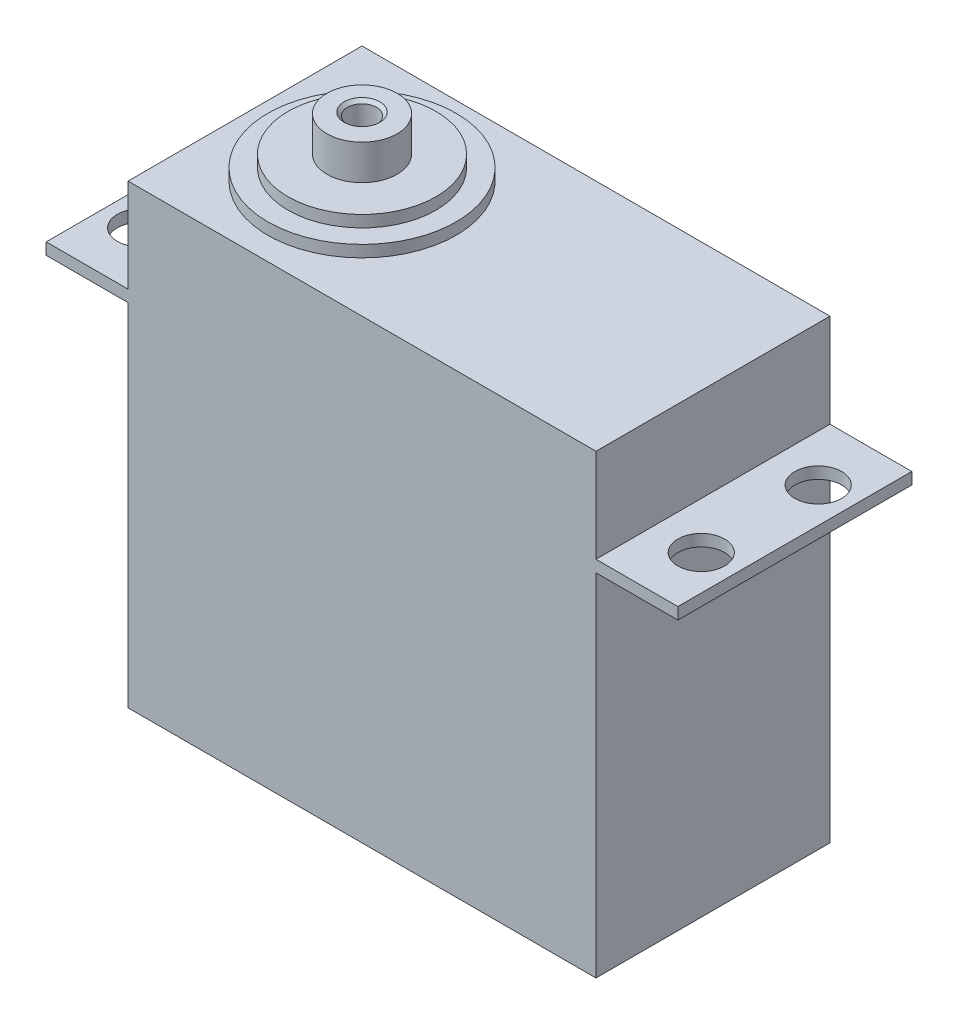
ISO-10303-21;
HEADER;
FILE_DESCRIPTION(('STEP AP214'),'2;1');
FILE_NAME('part.step','',(''),(''),'','','');
FILE_SCHEMA(('AUTOMOTIVE_DESIGN { 1 0 10303 214 1 1 1 1 }'));
ENDSEC;
DATA;
#1=APPLICATION_CONTEXT('core data for automotive mechanical design processes');
#2=APPLICATION_PROTOCOL_DEFINITION('international standard','automotive_design',2000,#1);
#3=PRODUCT_CONTEXT('',#1,'mechanical');
#4=PRODUCT('Part','Part','',(#3));
#5=PRODUCT_RELATED_PRODUCT_CATEGORY('part','',(#4));
#6=PRODUCT_DEFINITION_FORMATION('','',#4);
#7=PRODUCT_DEFINITION_CONTEXT('part definition',#1,'design');
#8=PRODUCT_DEFINITION('design','',#6,#7);
#9=PRODUCT_DEFINITION_SHAPE('','',#8);
#10=(LENGTH_UNIT() NAMED_UNIT(*) SI_UNIT(.MILLI.,.METRE.));
#11=(NAMED_UNIT(*) PLANE_ANGLE_UNIT() SI_UNIT($,.RADIAN.));
#12=(NAMED_UNIT(*) SI_UNIT($,.STERADIAN.) SOLID_ANGLE_UNIT());
#13=UNCERTAINTY_MEASURE_WITH_UNIT(LENGTH_MEASURE(1.E-05),#10,'distance_accuracy_value','');
#14=(GEOMETRIC_REPRESENTATION_CONTEXT(3) GLOBAL_UNCERTAINTY_ASSIGNED_CONTEXT((#13)) GLOBAL_UNIT_ASSIGNED_CONTEXT((#10,
#11,#12)) REPRESENTATION_CONTEXT('',''));
#15=CARTESIAN_POINT('',(0.,0.,0.));
#16=DIRECTION('',(0.,0.,1.));
#17=DIRECTION('',(1.,0.,0.));
#18=AXIS2_PLACEMENT_3D('',#15,#16,#17);
#19=CARTESIAN_POINT('',(-27.,11.5,0.));
#20=DIRECTION('',(0.,1.,0.));
#21=DIRECTION('',(0.,0.,1.));
#22=AXIS2_PLACEMENT_3D('',#19,#20,#21);
#23=PLANE('',#22);
#24=CARTESIAN_POINT('',(-24.,11.5,14.9262188694551));
#25=DIRECTION('',(0.,-1.,0.));
#26=DIRECTION('',(0.,0.,-1.));
#27=AXIS2_PLACEMENT_3D('',#24,#25,#26);
#28=CIRCLE('',#27,2.);
#29=CARTESIAN_POINT('',(-24.,11.5,12.9262188694551));
#30=VERTEX_POINT('',#29);
#31=EDGE_CURVE('E192',#30,#30,#28,.T.);
#32=ORIENTED_EDGE('',*,*,#31,.T.);
#33=EDGE_LOOP('',(#32));
#34=FACE_BOUND('',#33,.T.);
#35=DIRECTION('',(0.,0.,1.));
#36=VECTOR('',#35,1.);
#37=CARTESIAN_POINT('',(-20.,11.5,0.));
#38=LINE('',#37,#36);
#39=CARTESIAN_POINT('',(-20.,11.5,0.));
#40=VERTEX_POINT('',#39);
#41=CARTESIAN_POINT('',(-20.,11.5,20.));
#42=VERTEX_POINT('',#41);
#43=EDGE_CURVE('E230',#40,#42,#38,.T.);
#44=ORIENTED_EDGE('',*,*,#43,.F.);
#45=DIRECTION('',(1.,0.,0.));
#46=VECTOR('',#45,1.);
#47=CARTESIAN_POINT('',(-27.,11.5,0.));
#48=LINE('',#47,#46);
#49=CARTESIAN_POINT('',(-27.,11.5,0.));
#50=VERTEX_POINT('',#49);
#51=EDGE_CURVE('E257',#50,#40,#48,.T.);
#52=ORIENTED_EDGE('',*,*,#51,.F.);
#53=DIRECTION('',(0.,0.,1.));
#54=VECTOR('',#53,1.);
#55=CARTESIAN_POINT('',(-27.,11.5,0.));
#56=LINE('',#55,#54);
#57=CARTESIAN_POINT('',(-27.,11.5,20.));
#58=VERTEX_POINT('',#57);
#59=EDGE_CURVE('E235',#50,#58,#56,.T.);
#60=ORIENTED_EDGE('',*,*,#59,.T.);
#61=DIRECTION('',(1.,0.,0.));
#62=VECTOR('',#61,1.);
#63=CARTESIAN_POINT('',(-27.,11.5,20.));
#64=LINE('',#63,#62);
#65=EDGE_CURVE('E75',#58,#42,#64,.T.);
#66=ORIENTED_EDGE('',*,*,#65,.T.);
#67=EDGE_LOOP('',(#44,#52,#60,#66));
#68=FACE_BOUND('',#67,.T.);
#69=CARTESIAN_POINT('',(-24.,11.5,5.07378113054492));
#70=DIRECTION('',(0.,1.,0.));
#71=DIRECTION('',(0.,0.,1.));
#72=AXIS2_PLACEMENT_3D('',#69,#70,#71);
#73=CIRCLE('',#72,2.);
#74=CARTESIAN_POINT('',(-24.,11.5,7.07378113054492));
#75=VERTEX_POINT('',#74);
#76=EDGE_CURVE('E187',#75,#75,#73,.T.);
#77=ORIENTED_EDGE('',*,*,#76,.F.);
#78=EDGE_LOOP('',(#77));
#79=FACE_BOUND('',#78,.T.);
#80=ADVANCED_FACE('F49',(#34,#68,#79),#23,.T.);
#81=CARTESIAN_POINT('',(-27.,10.5,0.));
#82=DIRECTION('',(0.,1.,0.));
#83=DIRECTION('',(0.,0.,1.));
#84=AXIS2_PLACEMENT_3D('',#81,#82,#83);
#85=PLANE('',#84);
#86=DIRECTION('',(0.,0.,1.));
#87=VECTOR('',#86,1.);
#88=CARTESIAN_POINT('',(-20.,10.5,0.));
#89=LINE('',#88,#87);
#90=CARTESIAN_POINT('',(-20.,10.5,0.));
#91=VERTEX_POINT('',#90);
#92=CARTESIAN_POINT('',(-20.,10.5,20.));
#93=VERTEX_POINT('',#92);
#94=EDGE_CURVE('E236',#91,#93,#89,.T.);
#95=ORIENTED_EDGE('',*,*,#94,.T.);
#96=DIRECTION('',(1.,0.,0.));
#97=VECTOR('',#96,1.);
#98=CARTESIAN_POINT('',(-27.,10.5,20.));
#99=LINE('',#98,#97);
#100=CARTESIAN_POINT('',(-27.,10.5,20.));
#101=VERTEX_POINT('',#100);
#102=EDGE_CURVE('E246',#101,#93,#99,.T.);
#103=ORIENTED_EDGE('',*,*,#102,.F.);
#104=DIRECTION('',(0.,0.,1.));
#105=VECTOR('',#104,1.);
#106=CARTESIAN_POINT('',(-27.,10.5,0.));
#107=LINE('',#106,#105);
#108=CARTESIAN_POINT('',(-27.,10.5,0.));
#109=VERTEX_POINT('',#108);
#110=EDGE_CURVE('E243',#109,#101,#107,.T.);
#111=ORIENTED_EDGE('',*,*,#110,.F.);
#112=DIRECTION('',(1.,0.,0.));
#113=VECTOR('',#112,1.);
#114=CARTESIAN_POINT('',(-27.,10.5,0.));
#115=LINE('',#114,#113);
#116=EDGE_CURVE('E254',#109,#91,#115,.T.);
#117=ORIENTED_EDGE('',*,*,#116,.T.);
#118=EDGE_LOOP('',(#95,#103,#111,#117));
#119=FACE_BOUND('',#118,.T.);
#120=CARTESIAN_POINT('',(-24.,10.5,14.9262188694551));
#121=DIRECTION('',(0.,1.,0.));
#122=DIRECTION('',(0.,0.,1.));
#123=AXIS2_PLACEMENT_3D('',#120,#121,#122);
#124=CIRCLE('',#123,2.);
#125=CARTESIAN_POINT('',(-24.,10.5,16.9262188694551));
#126=VERTEX_POINT('',#125);
#127=EDGE_CURVE('E191',#126,#126,#124,.F.);
#128=ORIENTED_EDGE('',*,*,#127,.F.);
#129=EDGE_LOOP('',(#128));
#130=FACE_BOUND('',#129,.T.);
#131=CARTESIAN_POINT('',(-24.,10.5,5.07378113054492));
#132=DIRECTION('',(0.,1.,0.));
#133=DIRECTION('',(0.,0.,1.));
#134=AXIS2_PLACEMENT_3D('',#131,#132,#133);
#135=CIRCLE('',#134,2.);
#136=CARTESIAN_POINT('',(-24.,10.5,7.07378113054492));
#137=VERTEX_POINT('',#136);
#138=EDGE_CURVE('E216',#137,#137,#135,.T.);
#139=ORIENTED_EDGE('',*,*,#138,.T.);
#140=EDGE_LOOP('',(#139));
#141=FACE_BOUND('',#140,.T.);
#142=ADVANCED_FACE('F342',(#119,#130,#141),#85,.F.);
#143=CARTESIAN_POINT('',(20.,19.5,20.));
#144=DIRECTION('',(-1.,0.,0.));
#145=DIRECTION('',(0.,-1.,0.));
#146=AXIS2_PLACEMENT_3D('',#143,#144,#145);
#147=PLANE('',#146);
#148=DIRECTION('',(0.,0.,-1.));
#149=VECTOR('',#148,1.);
#150=CARTESIAN_POINT('',(20.,10.5,0.));
#151=LINE('',#150,#149);
#152=CARTESIAN_POINT('',(20.,10.5,20.));
#153=VERTEX_POINT('',#152);
#154=CARTESIAN_POINT('',(20.,10.5,0.));
#155=VERTEX_POINT('',#154);
#156=EDGE_CURVE('E202',#153,#155,#151,.T.);
#157=ORIENTED_EDGE('',*,*,#156,.F.);
#158=DIRECTION('',(0.,1.,0.));
#159=VECTOR('',#158,1.);
#160=CARTESIAN_POINT('',(20.,19.5,20.));
#161=LINE('',#160,#159);
#162=CARTESIAN_POINT('',(20.,-19.5,20.));
#163=VERTEX_POINT('',#162);
#164=EDGE_CURVE('E263',#163,#153,#161,.T.);
#165=ORIENTED_EDGE('',*,*,#164,.F.);
#166=DIRECTION('',(0.,0.,-1.));
#167=VECTOR('',#166,1.);
#168=CARTESIAN_POINT('',(20.,-19.5,20.));
#169=LINE('',#168,#167);
#170=CARTESIAN_POINT('',(20.,-19.5,0.));
#171=VERTEX_POINT('',#170);
#172=EDGE_CURVE('E279',#163,#171,#169,.T.);
#173=ORIENTED_EDGE('',*,*,#172,.T.);
#174=DIRECTION('',(0.,1.,0.));
#175=VECTOR('',#174,1.);
#176=CARTESIAN_POINT('',(20.,19.5,0.));
#177=LINE('',#176,#175);
#178=EDGE_CURVE('E280',#171,#155,#177,.T.);
#179=ORIENTED_EDGE('',*,*,#178,.T.);
#180=EDGE_LOOP('',(#157,#165,#173,#179));
#181=FACE_BOUND('',#180,.T.);
#182=ADVANCED_FACE('F348',(#181),#147,.F.);
#183=CARTESIAN_POINT('',(-20.,19.5,20.));
#184=DIRECTION('',(1.,0.,0.));
#185=DIRECTION('',(0.,0.,-1.));
#186=AXIS2_PLACEMENT_3D('',#183,#184,#185);
#187=PLANE('',#186);
#188=ORIENTED_EDGE('',*,*,#94,.F.);
#189=DIRECTION('',(0.,-1.,0.));
#190=VECTOR('',#189,1.);
#191=CARTESIAN_POINT('',(-20.,19.5,0.));
#192=LINE('',#191,#190);
#193=CARTESIAN_POINT('',(-20.,-19.5,0.));
#194=VERTEX_POINT('',#193);
#195=EDGE_CURVE('E287',#91,#194,#192,.T.);
#196=ORIENTED_EDGE('',*,*,#195,.T.);
#197=DIRECTION('',(0.,0.,-1.));
#198=VECTOR('',#197,1.);
#199=CARTESIAN_POINT('',(-20.,-19.5,20.));
#200=LINE('',#199,#198);
#201=CARTESIAN_POINT('',(-20.,-19.5,20.));
#202=VERTEX_POINT('',#201);
#203=EDGE_CURVE('E298',#202,#194,#200,.T.);
#204=ORIENTED_EDGE('',*,*,#203,.F.);
#205=DIRECTION('',(0.,-1.,0.));
#206=VECTOR('',#205,1.);
#207=CARTESIAN_POINT('',(-20.,19.5,20.));
#208=LINE('',#207,#206);
#209=EDGE_CURVE('E271',#93,#202,#208,.T.);
#210=ORIENTED_EDGE('',*,*,#209,.F.);
#211=EDGE_LOOP('',(#188,#196,#204,#210));
#212=FACE_BOUND('',#211,.T.);
#213=ADVANCED_FACE('F370',(#212),#187,.F.);
#214=CARTESIAN_POINT('',(20.,11.5,20.));
#215=VERTEX_POINT('',#214);
#216=CARTESIAN_POINT('',(20.,19.5,20.));
#217=VERTEX_POINT('',#216);
#218=EDGE_CURVE('E268',#215,#217,#161,.T.);
#219=ORIENTED_EDGE('',*,*,#218,.F.);
#220=DIRECTION('',(0.,0.,-1.));
#221=VECTOR('',#220,1.);
#222=CARTESIAN_POINT('',(20.,11.5,0.));
#223=LINE('',#222,#221);
#224=CARTESIAN_POINT('',(20.,11.5,0.));
#225=VERTEX_POINT('',#224);
#226=EDGE_CURVE('E213',#215,#225,#223,.T.);
#227=ORIENTED_EDGE('',*,*,#226,.T.);
#228=CARTESIAN_POINT('',(20.,19.5,0.));
#229=VERTEX_POINT('',#228);
#230=EDGE_CURVE('E262',#225,#229,#177,.T.);
#231=ORIENTED_EDGE('',*,*,#230,.T.);
#232=DIRECTION('',(0.,0.,-1.));
#233=VECTOR('',#232,1.);
#234=CARTESIAN_POINT('',(20.,19.5,20.));
#235=LINE('',#234,#233);
#236=EDGE_CURVE('E306',#217,#229,#235,.T.);
#237=ORIENTED_EDGE('',*,*,#236,.F.);
#238=EDGE_LOOP('',(#219,#227,#231,#237));
#239=FACE_BOUND('',#238,.T.);
#240=ADVANCED_FACE('F51',(#239),#147,.F.);
#241=CARTESIAN_POINT('',(-20.,19.5,20.));
#242=DIRECTION('',(0.,-1.,0.));
#243=DIRECTION('',(0.,0.,-1.));
#244=AXIS2_PLACEMENT_3D('',#241,#242,#243);
#245=PLANE('',#244);
#246=CARTESIAN_POINT('',(-10.,19.5,10.));
#247=DIRECTION('',(0.,-1.,0.));
#248=DIRECTION('',(0.,0.,-1.));
#249=AXIS2_PLACEMENT_3D('',#246,#247,#248);
#250=CIRCLE('',#249,8.04511830943609);
#251=CARTESIAN_POINT('',(-10.,19.5,1.95488169056391));
#252=VERTEX_POINT('',#251);
#253=EDGE_CURVE('E53',#252,#252,#250,.F.);
#254=ORIENTED_EDGE('',*,*,#253,.F.);
#255=EDGE_LOOP('',(#254));
#256=FACE_BOUND('',#255,.T.);
#257=DIRECTION('',(-1.,0.,0.));
#258=VECTOR('',#257,1.);
#259=CARTESIAN_POINT('',(-20.,19.5,0.));
#260=LINE('',#259,#258);
#261=CARTESIAN_POINT('',(-20.,19.5,0.));
#262=VERTEX_POINT('',#261);
#263=EDGE_CURVE('E284',#229,#262,#260,.T.);
#264=ORIENTED_EDGE('',*,*,#263,.T.);
#265=DIRECTION('',(0.,0.,-1.));
#266=VECTOR('',#265,1.);
#267=CARTESIAN_POINT('',(-20.,19.5,20.));
#268=LINE('',#267,#266);
#269=CARTESIAN_POINT('',(-20.,19.5,20.));
#270=VERTEX_POINT('',#269);
#271=EDGE_CURVE('E302',#270,#262,#268,.T.);
#272=ORIENTED_EDGE('',*,*,#271,.F.);
#273=DIRECTION('',(-1.,0.,0.));
#274=VECTOR('',#273,1.);
#275=CARTESIAN_POINT('',(-20.,19.5,20.));
#276=LINE('',#275,#274);
#277=EDGE_CURVE('E267',#217,#270,#276,.T.);
#278=ORIENTED_EDGE('',*,*,#277,.F.);
#279=ORIENTED_EDGE('',*,*,#236,.T.);
#280=EDGE_LOOP('',(#264,#272,#278,#279));
#281=FACE_BOUND('',#280,.T.);
#282=ADVANCED_FACE('F368',(#256,#281),#245,.F.);
#283=EDGE_CURVE('E288',#262,#40,#192,.T.);
#284=ORIENTED_EDGE('',*,*,#283,.T.);
#285=ORIENTED_EDGE('',*,*,#43,.T.);
#286=EDGE_CURVE('E272',#270,#42,#208,.T.);
#287=ORIENTED_EDGE('',*,*,#286,.F.);
#288=ORIENTED_EDGE('',*,*,#271,.T.);
#289=EDGE_LOOP('',(#284,#285,#287,#288));
#290=FACE_BOUND('',#289,.T.);
#291=ADVANCED_FACE('F365',(#290),#187,.F.);
#292=CARTESIAN_POINT('',(-20.,-19.5,20.));
#293=DIRECTION('',(0.,1.,0.));
#294=DIRECTION('',(0.,0.,1.));
#295=AXIS2_PLACEMENT_3D('',#292,#293,#294);
#296=PLANE('',#295);
#297=DIRECTION('',(1.,0.,0.));
#298=VECTOR('',#297,1.);
#299=CARTESIAN_POINT('',(-20.,-19.5,0.));
#300=LINE('',#299,#298);
#301=EDGE_CURVE('E292',#194,#171,#300,.T.);
#302=ORIENTED_EDGE('',*,*,#301,.T.);
#303=ORIENTED_EDGE('',*,*,#172,.F.);
#304=DIRECTION('',(1.,0.,0.));
#305=VECTOR('',#304,1.);
#306=CARTESIAN_POINT('',(-20.,-19.5,20.));
#307=LINE('',#306,#305);
#308=EDGE_CURVE('E276',#202,#163,#307,.T.);
#309=ORIENTED_EDGE('',*,*,#308,.F.);
#310=ORIENTED_EDGE('',*,*,#203,.T.);
#311=EDGE_LOOP('',(#302,#303,#309,#310));
#312=FACE_BOUND('',#311,.T.);
#313=ADVANCED_FACE('F357',(#312),#296,.F.);
#314=CARTESIAN_POINT('',(0.,0.,20.));
#315=DIRECTION('',(0.,0.,1.));
#316=DIRECTION('',(1.,0.,0.));
#317=AXIS2_PLACEMENT_3D('',#314,#315,#316);
#318=PLANE('',#317);
#319=ORIENTED_EDGE('',*,*,#164,.T.);
#320=DIRECTION('',(-1.,0.,0.));
#321=VECTOR('',#320,1.);
#322=CARTESIAN_POINT('',(27.,10.5,20.));
#323=LINE('',#322,#321);
#324=CARTESIAN_POINT('',(27.,10.5,20.));
#325=VERTEX_POINT('',#324);
#326=EDGE_CURVE('E222',#325,#153,#323,.T.);
#327=ORIENTED_EDGE('',*,*,#326,.F.);
#328=DIRECTION('',(0.,1.,0.));
#329=VECTOR('',#328,1.);
#330=CARTESIAN_POINT('',(27.,0.,20.));
#331=LINE('',#330,#329);
#332=CARTESIAN_POINT('',(27.,11.5,20.));
#333=VERTEX_POINT('',#332);
#334=EDGE_CURVE('E205',#325,#333,#331,.T.);
#335=ORIENTED_EDGE('',*,*,#334,.T.);
#336=DIRECTION('',(-1.,0.,0.));
#337=VECTOR('',#336,1.);
#338=CARTESIAN_POINT('',(27.,11.5,20.));
#339=LINE('',#338,#337);
#340=EDGE_CURVE('E225',#333,#215,#339,.T.);
#341=ORIENTED_EDGE('',*,*,#340,.T.);
#342=ORIENTED_EDGE('',*,*,#218,.T.);
#343=ORIENTED_EDGE('',*,*,#277,.T.);
#344=ORIENTED_EDGE('',*,*,#286,.T.);
#345=ORIENTED_EDGE('',*,*,#65,.F.);
#346=DIRECTION('',(0.,-1.,0.));
#347=VECTOR('',#346,1.);
#348=CARTESIAN_POINT('',(-27.,0.,20.));
#349=LINE('',#348,#347);
#350=EDGE_CURVE('E231',#58,#101,#349,.T.);
#351=ORIENTED_EDGE('',*,*,#350,.T.);
#352=ORIENTED_EDGE('',*,*,#102,.T.);
#353=ORIENTED_EDGE('',*,*,#209,.T.);
#354=ORIENTED_EDGE('',*,*,#308,.T.);
#355=EDGE_LOOP('',(#319,#327,#335,#341,#342,#343,#344,#345,#351,#352,#353,#354));
#356=FACE_BOUND('',#355,.T.);
#357=ADVANCED_FACE('F353',(#356),#318,.T.);
#358=CARTESIAN_POINT('',(0.,0.,0.));
#359=DIRECTION('',(0.,0.,1.));
#360=DIRECTION('',(1.,0.,0.));
#361=AXIS2_PLACEMENT_3D('',#358,#359,#360);
#362=PLANE('',#361);
#363=ORIENTED_EDGE('',*,*,#178,.F.);
#364=ORIENTED_EDGE('',*,*,#301,.F.);
#365=ORIENTED_EDGE('',*,*,#195,.F.);
#366=ORIENTED_EDGE('',*,*,#116,.F.);
#367=DIRECTION('',(0.,1.,0.));
#368=VECTOR('',#367,1.);
#369=CARTESIAN_POINT('',(-27.,0.,0.));
#370=LINE('',#369,#368);
#371=EDGE_CURVE('E239',#109,#50,#370,.T.);
#372=ORIENTED_EDGE('',*,*,#371,.T.);
#373=ORIENTED_EDGE('',*,*,#51,.T.);
#374=ORIENTED_EDGE('',*,*,#283,.F.);
#375=ORIENTED_EDGE('',*,*,#263,.F.);
#376=ORIENTED_EDGE('',*,*,#230,.F.);
#377=DIRECTION('',(-1.,0.,0.));
#378=VECTOR('',#377,1.);
#379=CARTESIAN_POINT('',(27.,11.5,0.));
#380=LINE('',#379,#378);
#381=CARTESIAN_POINT('',(27.,11.5,0.));
#382=VERTEX_POINT('',#381);
#383=EDGE_CURVE('E67',#382,#225,#380,.T.);
#384=ORIENTED_EDGE('',*,*,#383,.F.);
#385=DIRECTION('',(0.,-1.,0.));
#386=VECTOR('',#385,1.);
#387=CARTESIAN_POINT('',(27.,0.,0.));
#388=LINE('',#387,#386);
#389=CARTESIAN_POINT('',(27.,10.5,0.));
#390=VERTEX_POINT('',#389);
#391=EDGE_CURVE('E197',#382,#390,#388,.T.);
#392=ORIENTED_EDGE('',*,*,#391,.T.);
#393=DIRECTION('',(-1.,0.,0.));
#394=VECTOR('',#393,1.);
#395=CARTESIAN_POINT('',(27.,10.5,0.));
#396=LINE('',#395,#394);
#397=EDGE_CURVE('E212',#390,#155,#396,.T.);
#398=ORIENTED_EDGE('',*,*,#397,.T.);
#399=EDGE_LOOP('',(#363,#364,#365,#366,#372,#373,#374,#375,#376,#384,#392,#398));
#400=FACE_BOUND('',#399,.T.);
#401=ADVANCED_FACE('F356',(#400),#362,.F.);
#402=CARTESIAN_POINT('',(-27.,0.,0.));
#403=DIRECTION('',(-1.,0.,0.));
#404=DIRECTION('',(0.,0.,1.));
#405=AXIS2_PLACEMENT_3D('',#402,#403,#404);
#406=PLANE('',#405);
#407=ORIENTED_EDGE('',*,*,#350,.F.);
#408=ORIENTED_EDGE('',*,*,#59,.F.);
#409=ORIENTED_EDGE('',*,*,#371,.F.);
#410=ORIENTED_EDGE('',*,*,#110,.T.);
#411=EDGE_LOOP('',(#407,#408,#409,#410));
#412=FACE_BOUND('',#411,.T.);
#413=ADVANCED_FACE('F361',(#412),#406,.T.);
#414=CARTESIAN_POINT('',(27.,11.5,0.));
#415=DIRECTION('',(0.,1.,0.));
#416=DIRECTION('',(-1.,0.,0.));
#417=AXIS2_PLACEMENT_3D('',#414,#415,#416);
#418=PLANE('',#417);
#419=CARTESIAN_POINT('',(24.,11.5,15.));
#420=DIRECTION('',(0.,1.,0.));
#421=DIRECTION('',(1.,0.,0.));
#422=AXIS2_PLACEMENT_3D('',#419,#420,#421);
#423=CIRCLE('',#422,2.);
#424=CARTESIAN_POINT('',(26.,11.5,15.));
#425=VERTEX_POINT('',#424);
#426=EDGE_CURVE('E179',#425,#425,#423,.T.);
#427=ORIENTED_EDGE('',*,*,#426,.F.);
#428=EDGE_LOOP('',(#427));
#429=FACE_BOUND('',#428,.T.);
#430=CARTESIAN_POINT('',(24.,11.5,5.));
#431=DIRECTION('',(0.,1.,0.));
#432=DIRECTION('',(-1.,0.,0.));
#433=AXIS2_PLACEMENT_3D('',#430,#431,#432);
#434=CIRCLE('',#433,2.);
#435=CARTESIAN_POINT('',(22.,11.5,5.));
#436=VERTEX_POINT('',#435);
#437=EDGE_CURVE('E178',#436,#436,#434,.T.);
#438=ORIENTED_EDGE('',*,*,#437,.F.);
#439=EDGE_LOOP('',(#438));
#440=FACE_BOUND('',#439,.T.);
#441=ORIENTED_EDGE('',*,*,#226,.F.);
#442=ORIENTED_EDGE('',*,*,#340,.F.);
#443=DIRECTION('',(0.,0.,-1.));
#444=VECTOR('',#443,1.);
#445=CARTESIAN_POINT('',(27.,11.5,0.));
#446=LINE('',#445,#444);
#447=EDGE_CURVE('E201',#333,#382,#446,.T.);
#448=ORIENTED_EDGE('',*,*,#447,.T.);
#449=ORIENTED_EDGE('',*,*,#383,.T.);
#450=EDGE_LOOP('',(#441,#442,#448,#449));
#451=FACE_BOUND('',#450,.T.);
#452=ADVANCED_FACE('F419',(#429,#440,#451),#418,.T.);
#453=CARTESIAN_POINT('',(27.,10.5,0.));
#454=DIRECTION('',(0.,1.,0.));
#455=DIRECTION('',(-1.,0.,0.));
#456=AXIS2_PLACEMENT_3D('',#453,#454,#455);
#457=PLANE('',#456);
#458=CARTESIAN_POINT('',(24.,10.5,15.));
#459=DIRECTION('',(0.,1.,0.));
#460=DIRECTION('',(-1.,0.,0.));
#461=AXIS2_PLACEMENT_3D('',#458,#459,#460);
#462=CIRCLE('',#461,2.);
#463=CARTESIAN_POINT('',(22.,10.5,15.));
#464=VERTEX_POINT('',#463);
#465=EDGE_CURVE('E196',#464,#464,#462,.T.);
#466=ORIENTED_EDGE('',*,*,#465,.T.);
#467=EDGE_LOOP('',(#466));
#468=FACE_BOUND('',#467,.T.);
#469=CARTESIAN_POINT('',(24.,10.5,5.));
#470=DIRECTION('',(0.,1.,0.));
#471=DIRECTION('',(-1.,0.,0.));
#472=AXIS2_PLACEMENT_3D('',#469,#470,#471);
#473=CIRCLE('',#472,2.);
#474=CARTESIAN_POINT('',(22.,10.5,5.));
#475=VERTEX_POINT('',#474);
#476=EDGE_CURVE('E183',#475,#475,#473,.T.);
#477=ORIENTED_EDGE('',*,*,#476,.T.);
#478=EDGE_LOOP('',(#477));
#479=FACE_BOUND('',#478,.T.);
#480=ORIENTED_EDGE('',*,*,#156,.T.);
#481=ORIENTED_EDGE('',*,*,#397,.F.);
#482=DIRECTION('',(0.,0.,-1.));
#483=VECTOR('',#482,1.);
#484=CARTESIAN_POINT('',(27.,10.5,0.));
#485=LINE('',#484,#483);
#486=EDGE_CURVE('E209',#325,#390,#485,.T.);
#487=ORIENTED_EDGE('',*,*,#486,.F.);
#488=ORIENTED_EDGE('',*,*,#326,.T.);
#489=EDGE_LOOP('',(#480,#481,#487,#488));
#490=FACE_BOUND('',#489,.T.);
#491=ADVANCED_FACE('F322',(#468,#479,#490),#457,.F.);
#492=CARTESIAN_POINT('',(27.,0.,0.));
#493=DIRECTION('',(1.,0.,0.));
#494=DIRECTION('',(0.,0.,-1.));
#495=AXIS2_PLACEMENT_3D('',#492,#493,#494);
#496=PLANE('',#495);
#497=ORIENTED_EDGE('',*,*,#391,.F.);
#498=ORIENTED_EDGE('',*,*,#447,.F.);
#499=ORIENTED_EDGE('',*,*,#334,.F.);
#500=ORIENTED_EDGE('',*,*,#486,.T.);
#501=EDGE_LOOP('',(#497,#498,#499,#500));
#502=FACE_BOUND('',#501,.T.);
#503=ADVANCED_FACE('F418',(#502),#496,.T.);
#504=CARTESIAN_POINT('',(-24.,-19.5,14.9262188694551));
#505=DIRECTION('',(0.,1.,0.));
#506=DIRECTION('',(0.,0.,1.));
#507=AXIS2_PLACEMENT_3D('',#504,#505,#506);
#508=CYLINDRICAL_SURFACE('',#507,2.);
#509=ORIENTED_EDGE('',*,*,#31,.F.);
#510=EDGE_LOOP('',(#509));
#511=FACE_BOUND('',#510,.T.);
#512=ORIENTED_EDGE('',*,*,#127,.T.);
#513=EDGE_LOOP('',(#512));
#514=FACE_BOUND('',#513,.T.);
#515=ADVANCED_FACE('F434',(#511,#514),#508,.F.);
#516=CARTESIAN_POINT('',(-24.,-19.5,5.07378113054492));
#517=DIRECTION('',(0.,1.,0.));
#518=DIRECTION('',(0.,0.,1.));
#519=AXIS2_PLACEMENT_3D('',#516,#517,#518);
#520=CYLINDRICAL_SURFACE('',#519,2.);
#521=ORIENTED_EDGE('',*,*,#76,.T.);
#522=EDGE_LOOP('',(#521));
#523=FACE_BOUND('',#522,.T.);
#524=ORIENTED_EDGE('',*,*,#138,.F.);
#525=EDGE_LOOP('',(#524));
#526=FACE_BOUND('',#525,.T.);
#527=ADVANCED_FACE('F338',(#523,#526),#520,.F.);
#528=CARTESIAN_POINT('',(24.,-19.5,5.));
#529=DIRECTION('',(0.,1.,0.));
#530=DIRECTION('',(-1.,0.,0.));
#531=AXIS2_PLACEMENT_3D('',#528,#529,#530);
#532=CYLINDRICAL_SURFACE('',#531,2.);
#533=ORIENTED_EDGE('',*,*,#437,.T.);
#534=EDGE_LOOP('',(#533));
#535=FACE_BOUND('',#534,.T.);
#536=ORIENTED_EDGE('',*,*,#476,.F.);
#537=EDGE_LOOP('',(#536));
#538=FACE_BOUND('',#537,.T.);
#539=ADVANCED_FACE('F328',(#535,#538),#532,.F.);
#540=CARTESIAN_POINT('',(24.,-19.5,15.));
#541=DIRECTION('',(0.,1.,0.));
#542=DIRECTION('',(-1.,0.,0.));
#543=AXIS2_PLACEMENT_3D('',#540,#541,#542);
#544=CYLINDRICAL_SURFACE('',#543,2.);
#545=ORIENTED_EDGE('',*,*,#426,.T.);
#546=EDGE_LOOP('',(#545));
#547=FACE_BOUND('',#546,.T.);
#548=ORIENTED_EDGE('',*,*,#465,.F.);
#549=EDGE_LOOP('',(#548));
#550=FACE_BOUND('',#549,.T.);
#551=ADVANCED_FACE('F325',(#547,#550),#544,.F.);
#552=CARTESIAN_POINT('',(-10.,20.5,10.));
#553=DIRECTION('',(0.,-1.,0.));
#554=DIRECTION('',(0.,0.,-1.));
#555=AXIS2_PLACEMENT_3D('',#552,#553,#554);
#556=CYLINDRICAL_SURFACE('',#555,8.04511830943609);
#557=CARTESIAN_POINT('',(-10.,20.5,10.));
#558=DIRECTION('',(0.,1.,0.));
#559=DIRECTION('',(0.,0.,1.));
#560=AXIS2_PLACEMENT_3D('',#557,#558,#559);
#561=CIRCLE('',#560,8.04511830943609);
#562=CARTESIAN_POINT('',(-10.,20.5,18.0451183094361));
#563=VERTEX_POINT('',#562);
#564=EDGE_CURVE('E171',#563,#563,#561,.T.);
#565=ORIENTED_EDGE('',*,*,#564,.F.);
#566=EDGE_LOOP('',(#565));
#567=FACE_BOUND('',#566,.T.);
#568=ORIENTED_EDGE('',*,*,#253,.T.);
#569=EDGE_LOOP('',(#568));
#570=FACE_BOUND('',#569,.T.);
#571=ADVANCED_FACE('F327',(#567,#570),#556,.T.);
#572=CARTESIAN_POINT('',(-10.,20.5,10.));
#573=DIRECTION('',(0.,1.,0.));
#574=DIRECTION('',(0.,0.,1.));
#575=AXIS2_PLACEMENT_3D('',#572,#573,#574);
#576=PLANE('',#575);
#577=CARTESIAN_POINT('',(-10.,20.5,10.));
#578=DIRECTION('',(0.,1.,0.));
#579=DIRECTION('',(0.,0.,1.));
#580=AXIS2_PLACEMENT_3D('',#577,#578,#579);
#581=CIRCLE('',#580,6.3236748562844);
#582=CARTESIAN_POINT('',(-10.,20.5,16.3236748562844));
#583=VERTEX_POINT('',#582);
#584=EDGE_CURVE('E59',#583,#583,#581,.T.);
#585=ORIENTED_EDGE('',*,*,#584,.F.);
#586=EDGE_LOOP('',(#585));
#587=FACE_BOUND('',#586,.T.);
#588=ORIENTED_EDGE('',*,*,#564,.T.);
#589=EDGE_LOOP('',(#588));
#590=FACE_BOUND('',#589,.T.);
#591=ADVANCED_FACE('F335',(#587,#590),#576,.T.);
#592=CARTESIAN_POINT('',(-10.,21.5,10.));
#593=DIRECTION('',(0.,-1.,0.));
#594=DIRECTION('',(0.,0.,-1.));
#595=AXIS2_PLACEMENT_3D('',#592,#593,#594);
#596=CYLINDRICAL_SURFACE('',#595,6.3236748562844);
#597=CARTESIAN_POINT('',(-10.,21.5,10.));
#598=DIRECTION('',(0.,1.,0.));
#599=DIRECTION('',(0.,0.,1.));
#600=AXIS2_PLACEMENT_3D('',#597,#598,#599);
#601=CIRCLE('',#600,6.3236748562844);
#602=CARTESIAN_POINT('',(-10.,21.5,16.3236748562844));
#603=VERTEX_POINT('',#602);
#604=EDGE_CURVE('E161',#603,#603,#601,.T.);
#605=ORIENTED_EDGE('',*,*,#604,.F.);
#606=EDGE_LOOP('',(#605));
#607=FACE_BOUND('',#606,.T.);
#608=ORIENTED_EDGE('',*,*,#584,.T.);
#609=EDGE_LOOP('',(#608));
#610=FACE_BOUND('',#609,.T.);
#611=ADVANCED_FACE('F484',(#607,#610),#596,.T.);
#612=CARTESIAN_POINT('',(-10.,21.5,10.));
#613=DIRECTION('',(0.,1.,0.));
#614=DIRECTION('',(0.,0.,1.));
#615=AXIS2_PLACEMENT_3D('',#612,#613,#614);
#616=PLANE('',#615);
#617=CARTESIAN_POINT('',(-10.,21.5,10.));
#618=DIRECTION('',(0.,1.,0.));
#619=DIRECTION('',(0.,0.,1.));
#620=AXIS2_PLACEMENT_3D('',#617,#618,#619);
#621=CIRCLE('',#620,3.);
#622=CARTESIAN_POINT('',(-10.,21.5,13.));
#623=VERTEX_POINT('',#622);
#624=EDGE_CURVE('E11',#623,#623,#621,.T.);
#625=ORIENTED_EDGE('',*,*,#624,.F.);
#626=EDGE_LOOP('',(#625));
#627=FACE_BOUND('',#626,.T.);
#628=ORIENTED_EDGE('',*,*,#604,.T.);
#629=EDGE_LOOP('',(#628));
#630=FACE_BOUND('',#629,.T.);
#631=ADVANCED_FACE('F495',(#627,#630),#616,.T.);
#632=CARTESIAN_POINT('',(-10.,24.5,10.));
#633=DIRECTION('',(0.,-1.,0.));
#634=DIRECTION('',(0.,0.,-1.));
#635=AXIS2_PLACEMENT_3D('',#632,#633,#634);
#636=CYLINDRICAL_SURFACE('',#635,3.);
#637=CARTESIAN_POINT('',(-10.,24.5,10.));
#638=DIRECTION('',(0.,1.,0.));
#639=DIRECTION('',(0.,0.,1.));
#640=AXIS2_PLACEMENT_3D('',#637,#638,#639);
#641=CIRCLE('',#640,3.);
#642=CARTESIAN_POINT('',(-10.,24.5,13.));
#643=VERTEX_POINT('',#642);
#644=EDGE_CURVE('E155',#643,#643,#641,.T.);
#645=ORIENTED_EDGE('',*,*,#644,.F.);
#646=EDGE_LOOP('',(#645));
#647=FACE_BOUND('',#646,.T.);
#648=ORIENTED_EDGE('',*,*,#624,.T.);
#649=EDGE_LOOP('',(#648));
#650=FACE_BOUND('',#649,.T.);
#651=ADVANCED_FACE('F506',(#647,#650),#636,.T.);
#652=CARTESIAN_POINT('',(-10.,24.5,10.));
#653=DIRECTION('',(0.,1.,0.));
#654=DIRECTION('',(0.,0.,1.));
#655=AXIS2_PLACEMENT_3D('',#652,#653,#654);
#656=PLANE('',#655);
#657=CARTESIAN_POINT('',(-10.1095477356864,24.5,9.89100073102654));
#658=DIRECTION('',(0.,1.,0.));
#659=DIRECTION('',(0.,0.,1.));
#660=AXIS2_PLACEMENT_3D('',#657,#658,#659);
#661=CIRCLE('',#660,1.525);
#662=CARTESIAN_POINT('',(-10.1095477356864,24.5,11.4160007310265));
#663=VERTEX_POINT('',#662);
#664=EDGE_CURVE('E164',#663,#663,#661,.T.);
#665=ORIENTED_EDGE('',*,*,#664,.F.);
#666=EDGE_LOOP('',(#665));
#667=FACE_BOUND('',#666,.T.);
#668=ORIENTED_EDGE('',*,*,#644,.T.);
#669=EDGE_LOOP('',(#668));
#670=FACE_BOUND('',#669,.T.);
#671=ADVANCED_FACE('F148',(#667,#670),#656,.T.);
#672=CARTESIAN_POINT('',(-10.1095477356864,10.,9.89100073102654));
#673=DIRECTION('',(0.,1.,0.));
#674=DIRECTION('',(0.,0.,1.));
#675=AXIS2_PLACEMENT_3D('',#672,#673,#674);
#676=CONICAL_SURFACE('',#675,1.24999999999999,1.02974425867665);
#677=CARTESIAN_POINT('',(-10.1095477356864,9.24892422621556,9.89100073102654));
#678=VERTEX_POINT('',#677);
#679=VERTEX_LOOP('',#678);
#680=FACE_BOUND('',#679,.T.);
#681=CARTESIAN_POINT('',(-10.1095477356864,10.,9.89100073102654));
#682=DIRECTION('',(0.,1.,0.));
#683=DIRECTION('',(0.,0.,1.));
#684=AXIS2_PLACEMENT_3D('',#681,#682,#683);
#685=CIRCLE('',#684,1.24999999999999);
#686=CARTESIAN_POINT('',(-10.1095477356864,10.,11.1410007310265));
#687=VERTEX_POINT('',#686);
#688=EDGE_CURVE('E152',#687,#687,#685,.T.);
#689=ORIENTED_EDGE('',*,*,#688,.T.);
#690=EDGE_LOOP('',(#689));
#691=FACE_BOUND('',#690,.T.);
#692=ADVANCED_FACE('F144',(#680,#691),#676,.F.);
#693=CARTESIAN_POINT('',(-10.1095477356864,24.5,9.89100073102654));
#694=DIRECTION('',(0.,1.,0.));
#695=DIRECTION('',(0.,0.,1.));
#696=AXIS2_PLACEMENT_3D('',#693,#694,#695);
#697=CYLINDRICAL_SURFACE('',#696,1.24999999999999);
#698=ORIENTED_EDGE('',*,*,#688,.F.);
#699=EDGE_LOOP('',(#698));
#700=FACE_BOUND('',#699,.T.);
#701=CARTESIAN_POINT('',(-10.1095477356864,24.225,9.89100073102654));
#702=DIRECTION('',(0.,1.,0.));
#703=DIRECTION('',(0.,0.,1.));
#704=AXIS2_PLACEMENT_3D('',#701,#702,#703);
#705=CIRCLE('',#704,1.25);
#706=CARTESIAN_POINT('',(-10.1095477356864,24.225,11.1410007310265));
#707=VERTEX_POINT('',#706);
#708=EDGE_CURVE('E156',#707,#707,#705,.T.);
#709=ORIENTED_EDGE('',*,*,#708,.T.);
#710=EDGE_LOOP('',(#709));
#711=FACE_BOUND('',#710,.T.);
#712=ADVANCED_FACE('F147',(#700,#711),#697,.F.);
#713=CARTESIAN_POINT('',(-10.1095477356864,24.5,9.89100073102654));
#714=DIRECTION('',(0.,1.,0.));
#715=DIRECTION('',(0.,0.,1.));
#716=AXIS2_PLACEMENT_3D('',#713,#714,#715);
#717=CONICAL_SURFACE('',#716,1.525,0.785398163397445);
#718=ORIENTED_EDGE('',*,*,#708,.F.);
#719=EDGE_LOOP('',(#718));
#720=FACE_BOUND('',#719,.T.);
#721=ORIENTED_EDGE('',*,*,#664,.T.);
#722=EDGE_LOOP('',(#721));
#723=FACE_BOUND('',#722,.T.);
#724=ADVANCED_FACE('F545',(#720,#723),#717,.F.);
#725=CLOSED_SHELL('',(#80,#142,#182,#213,#240,#282,#291,#313,#357,#401,#413,#452,#491,#503,#515,
#527,#539,#551,#571,#591,#611,#631,#651,#671,#692,#712,#724));
#726=MANIFOLD_SOLID_BREP('B2',#725);
#727=ADVANCED_BREP_SHAPE_REPRESENTATION('',(#18,#726),#14);
#728=SHAPE_DEFINITION_REPRESENTATION(#9,#727);
ENDSEC;
END-ISO-10303-21;
